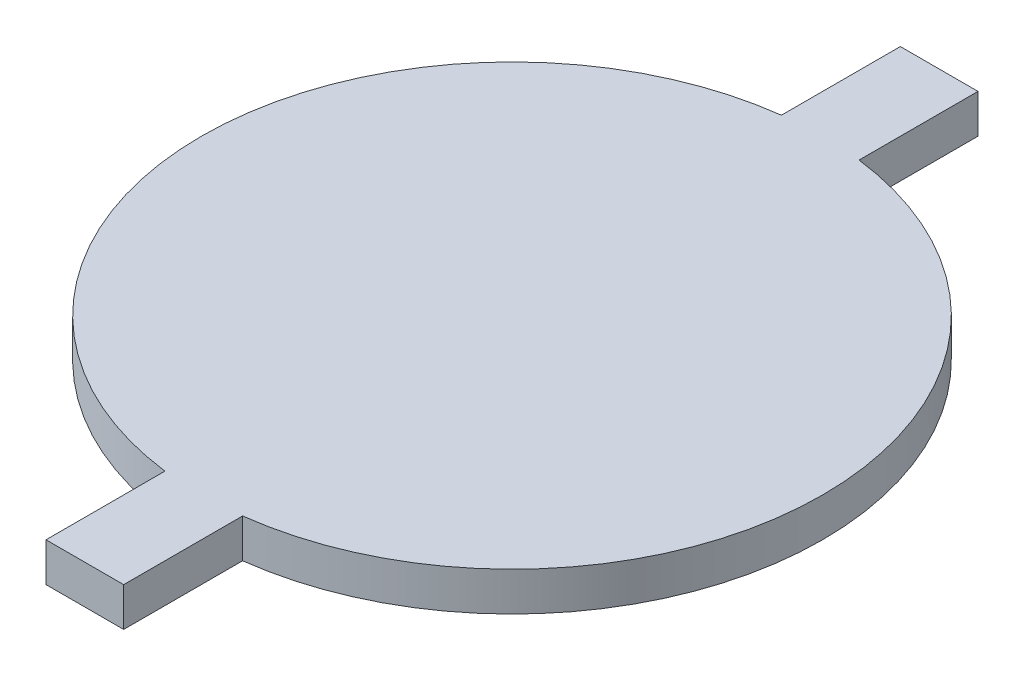
ISO-10303-21;
HEADER;
FILE_DESCRIPTION(('STEP AP214'),'2;1');
FILE_NAME('part.step','',(''),(''),'','','');
FILE_SCHEMA(('AUTOMOTIVE_DESIGN { 1 0 10303 214 1 1 1 1 }'));
ENDSEC;
DATA;
#1=APPLICATION_CONTEXT('core data for automotive mechanical design processes');
#2=APPLICATION_PROTOCOL_DEFINITION('international standard','automotive_design',2000,#1);
#3=PRODUCT_CONTEXT('',#1,'mechanical');
#4=PRODUCT('Part','Part','',(#3));
#5=PRODUCT_RELATED_PRODUCT_CATEGORY('part','',(#4));
#6=PRODUCT_DEFINITION_FORMATION('','',#4);
#7=PRODUCT_DEFINITION_CONTEXT('part definition',#1,'design');
#8=PRODUCT_DEFINITION('design','',#6,#7);
#9=PRODUCT_DEFINITION_SHAPE('','',#8);
#10=(LENGTH_UNIT() NAMED_UNIT(*) SI_UNIT(.MILLI.,.METRE.));
#11=(NAMED_UNIT(*) PLANE_ANGLE_UNIT() SI_UNIT($,.RADIAN.));
#12=(NAMED_UNIT(*) SI_UNIT($,.STERADIAN.) SOLID_ANGLE_UNIT());
#13=UNCERTAINTY_MEASURE_WITH_UNIT(LENGTH_MEASURE(1.E-05),#10,'distance_accuracy_value','');
#14=(GEOMETRIC_REPRESENTATION_CONTEXT(3) GLOBAL_UNCERTAINTY_ASSIGNED_CONTEXT((#13)) GLOBAL_UNIT_ASSIGNED_CONTEXT((#10,
#11,#12)) REPRESENTATION_CONTEXT('',''));
#15=CARTESIAN_POINT('',(0.,0.,0.));
#16=DIRECTION('',(0.,0.,1.));
#17=DIRECTION('',(1.,0.,0.));
#18=AXIS2_PLACEMENT_3D('',#15,#16,#17);
#19=CARTESIAN_POINT('',(0.,5.,0.));
#20=DIRECTION('',(0.,-1.,0.));
#21=DIRECTION('',(0.,0.,-1.));
#22=AXIS2_PLACEMENT_3D('',#19,#20,#21);
#23=CYLINDRICAL_SURFACE('',#22,40.);
#24=CARTESIAN_POINT('',(0.,0.,0.));
#25=DIRECTION('',(0.,1.,0.));
#26=DIRECTION('',(0.,0.,1.));
#27=AXIS2_PLACEMENT_3D('',#24,#25,#26);
#28=CIRCLE('',#27,40.);
#29=CARTESIAN_POINT('',(-5.,0.,-39.6862696659689));
#30=VERTEX_POINT('',#29);
#31=CARTESIAN_POINT('',(-5.,0.,39.6862696659689));
#32=VERTEX_POINT('',#31);
#33=EDGE_CURVE('E132',#30,#32,#28,.T.);
#34=ORIENTED_EDGE('',*,*,#33,.T.);
#35=DIRECTION('',(0.,-1.,0.));
#36=VECTOR('',#35,1.);
#37=CARTESIAN_POINT('',(-5.,5.,39.6862696659689));
#38=LINE('',#37,#36);
#39=CARTESIAN_POINT('',(-5.,5.,39.6862696659689));
#40=VERTEX_POINT('',#39);
#41=EDGE_CURVE('E11',#40,#32,#38,.T.);
#42=ORIENTED_EDGE('',*,*,#41,.F.);
#43=CARTESIAN_POINT('',(0.,5.,0.));
#44=DIRECTION('',(0.,1.,0.));
#45=DIRECTION('',(0.,0.,1.));
#46=AXIS2_PLACEMENT_3D('',#43,#44,#45);
#47=CIRCLE('',#46,40.);
#48=CARTESIAN_POINT('',(-5.,5.,-39.6862696659689));
#49=VERTEX_POINT('',#48);
#50=EDGE_CURVE('E91',#49,#40,#47,.T.);
#51=ORIENTED_EDGE('',*,*,#50,.F.);
#52=DIRECTION('',(0.,-1.,0.));
#53=VECTOR('',#52,1.);
#54=CARTESIAN_POINT('',(-5.,5.,-39.6862696659689));
#55=LINE('',#54,#53);
#56=EDGE_CURVE('E53',#49,#30,#55,.T.);
#57=ORIENTED_EDGE('',*,*,#56,.T.);
#58=EDGE_LOOP('',(#34,#42,#51,#57));
#59=FACE_BOUND('',#58,.T.);
#60=ADVANCED_FACE('F37',(#59),#23,.T.);
#61=CARTESIAN_POINT('',(-5.,5.,0.));
#62=DIRECTION('',(-1.,0.,0.));
#63=DIRECTION('',(0.,0.,1.));
#64=AXIS2_PLACEMENT_3D('',#61,#62,#63);
#65=PLANE('',#64);
#66=DIRECTION('',(0.,0.,-1.));
#67=VECTOR('',#66,1.);
#68=CARTESIAN_POINT('',(-5.,0.,0.));
#69=LINE('',#68,#67);
#70=CARTESIAN_POINT('',(-5.,0.,55.));
#71=VERTEX_POINT('',#70);
#72=EDGE_CURVE('E134',#71,#32,#69,.T.);
#73=ORIENTED_EDGE('',*,*,#72,.F.);
#74=DIRECTION('',(0.,-1.,0.));
#75=VECTOR('',#74,1.);
#76=CARTESIAN_POINT('',(-5.,5.,55.));
#77=LINE('',#76,#75);
#78=CARTESIAN_POINT('',(-5.,5.,55.));
#79=VERTEX_POINT('',#78);
#80=EDGE_CURVE('E45',#79,#71,#77,.T.);
#81=ORIENTED_EDGE('',*,*,#80,.F.);
#82=DIRECTION('',(0.,0.,-1.));
#83=VECTOR('',#82,1.);
#84=CARTESIAN_POINT('',(-5.,5.,0.));
#85=LINE('',#84,#83);
#86=EDGE_CURVE('E181',#79,#40,#85,.T.);
#87=ORIENTED_EDGE('',*,*,#86,.T.);
#88=ORIENTED_EDGE('',*,*,#41,.T.);
#89=EDGE_LOOP('',(#73,#81,#87,#88));
#90=FACE_BOUND('',#89,.T.);
#91=ADVANCED_FACE('F166',(#90),#65,.T.);
#92=CARTESIAN_POINT('',(0.,5.,55.));
#93=DIRECTION('',(0.,0.,1.));
#94=DIRECTION('',(1.,0.,0.));
#95=AXIS2_PLACEMENT_3D('',#92,#93,#94);
#96=PLANE('',#95);
#97=DIRECTION('',(-1.,0.,0.));
#98=VECTOR('',#97,1.);
#99=CARTESIAN_POINT('',(0.,0.,55.));
#100=LINE('',#99,#98);
#101=CARTESIAN_POINT('',(5.,0.,55.));
#102=VERTEX_POINT('',#101);
#103=EDGE_CURVE('E137',#102,#71,#100,.T.);
#104=ORIENTED_EDGE('',*,*,#103,.F.);
#105=DIRECTION('',(0.,-1.,0.));
#106=VECTOR('',#105,1.);
#107=CARTESIAN_POINT('',(5.,5.,55.));
#108=LINE('',#107,#106);
#109=CARTESIAN_POINT('',(5.,5.,55.));
#110=VERTEX_POINT('',#109);
#111=EDGE_CURVE('E156',#110,#102,#108,.T.);
#112=ORIENTED_EDGE('',*,*,#111,.F.);
#113=DIRECTION('',(-1.,0.,0.));
#114=VECTOR('',#113,1.);
#115=CARTESIAN_POINT('',(0.,5.,55.));
#116=LINE('',#115,#114);
#117=EDGE_CURVE('E163',#110,#79,#116,.T.);
#118=ORIENTED_EDGE('',*,*,#117,.T.);
#119=ORIENTED_EDGE('',*,*,#80,.T.);
#120=EDGE_LOOP('',(#104,#112,#118,#119));
#121=FACE_BOUND('',#120,.T.);
#122=ADVANCED_FACE('F161',(#121),#96,.T.);
#123=CARTESIAN_POINT('',(5.,5.,0.));
#124=DIRECTION('',(-1.,0.,0.));
#125=DIRECTION('',(0.,0.,1.));
#126=AXIS2_PLACEMENT_3D('',#123,#124,#125);
#127=PLANE('',#126);
#128=DIRECTION('',(0.,0.,-1.));
#129=VECTOR('',#128,1.);
#130=CARTESIAN_POINT('',(5.,0.,0.));
#131=LINE('',#130,#129);
#132=CARTESIAN_POINT('',(5.,0.,39.6862696659689));
#133=VERTEX_POINT('',#132);
#134=EDGE_CURVE('E140',#102,#133,#131,.T.);
#135=ORIENTED_EDGE('',*,*,#134,.T.);
#136=DIRECTION('',(0.,-1.,0.));
#137=VECTOR('',#136,1.);
#138=CARTESIAN_POINT('',(5.,5.,39.6862696659689));
#139=LINE('',#138,#137);
#140=CARTESIAN_POINT('',(5.,5.,39.6862696659689));
#141=VERTEX_POINT('',#140);
#142=EDGE_CURVE('E153',#141,#133,#139,.T.);
#143=ORIENTED_EDGE('',*,*,#142,.F.);
#144=DIRECTION('',(0.,0.,-1.));
#145=VECTOR('',#144,1.);
#146=CARTESIAN_POINT('',(5.,5.,0.));
#147=LINE('',#146,#145);
#148=EDGE_CURVE('E177',#110,#141,#147,.T.);
#149=ORIENTED_EDGE('',*,*,#148,.F.);
#150=ORIENTED_EDGE('',*,*,#111,.T.);
#151=EDGE_LOOP('',(#135,#143,#149,#150));
#152=FACE_BOUND('',#151,.T.);
#153=ADVANCED_FACE('F173',(#152),#127,.F.);
#154=CARTESIAN_POINT('',(0.,5.,0.));
#155=DIRECTION('',(0.,-1.,0.));
#156=DIRECTION('',(0.,0.,-1.));
#157=AXIS2_PLACEMENT_3D('',#154,#155,#156);
#158=CYLINDRICAL_SURFACE('',#157,40.);
#159=CARTESIAN_POINT('',(0.,0.,0.));
#160=DIRECTION('',(0.,1.,0.));
#161=DIRECTION('',(0.,0.,1.));
#162=AXIS2_PLACEMENT_3D('',#159,#160,#161);
#163=CIRCLE('',#162,40.);
#164=CARTESIAN_POINT('',(5.,0.,-39.6862696659689));
#165=VERTEX_POINT('',#164);
#166=EDGE_CURVE('E142',#133,#165,#163,.T.);
#167=ORIENTED_EDGE('',*,*,#166,.T.);
#168=DIRECTION('',(0.,-1.,0.));
#169=VECTOR('',#168,1.);
#170=CARTESIAN_POINT('',(5.,5.,-39.6862696659689));
#171=LINE('',#170,#169);
#172=CARTESIAN_POINT('',(5.,5.,-39.6862696659689));
#173=VERTEX_POINT('',#172);
#174=EDGE_CURVE('E124',#173,#165,#171,.T.);
#175=ORIENTED_EDGE('',*,*,#174,.F.);
#176=CARTESIAN_POINT('',(0.,5.,0.));
#177=DIRECTION('',(0.,1.,0.));
#178=DIRECTION('',(0.,0.,1.));
#179=AXIS2_PLACEMENT_3D('',#176,#177,#178);
#180=CIRCLE('',#179,40.);
#181=EDGE_CURVE('E112',#141,#173,#180,.T.);
#182=ORIENTED_EDGE('',*,*,#181,.F.);
#183=ORIENTED_EDGE('',*,*,#142,.T.);
#184=EDGE_LOOP('',(#167,#175,#182,#183));
#185=FACE_BOUND('',#184,.T.);
#186=ADVANCED_FACE('F176',(#185),#158,.T.);
#187=CARTESIAN_POINT('',(5.,5.,0.));
#188=DIRECTION('',(-1.,0.,0.));
#189=DIRECTION('',(0.,0.,1.));
#190=AXIS2_PLACEMENT_3D('',#187,#188,#189);
#191=PLANE('',#190);
#192=DIRECTION('',(0.,0.,-1.));
#193=VECTOR('',#192,1.);
#194=CARTESIAN_POINT('',(5.,0.,0.));
#195=LINE('',#194,#193);
#196=CARTESIAN_POINT('',(5.,0.,-55.));
#197=VERTEX_POINT('',#196);
#198=EDGE_CURVE('E121',#165,#197,#195,.T.);
#199=ORIENTED_EDGE('',*,*,#198,.T.);
#200=DIRECTION('',(0.,-1.,0.));
#201=VECTOR('',#200,1.);
#202=CARTESIAN_POINT('',(5.,5.,-55.));
#203=LINE('',#202,#201);
#204=CARTESIAN_POINT('',(5.,5.,-55.));
#205=VERTEX_POINT('',#204);
#206=EDGE_CURVE('E118',#205,#197,#203,.T.);
#207=ORIENTED_EDGE('',*,*,#206,.F.);
#208=DIRECTION('',(0.,0.,-1.));
#209=VECTOR('',#208,1.);
#210=CARTESIAN_POINT('',(5.,5.,0.));
#211=LINE('',#210,#209);
#212=EDGE_CURVE('E106',#173,#205,#211,.T.);
#213=ORIENTED_EDGE('',*,*,#212,.F.);
#214=ORIENTED_EDGE('',*,*,#174,.T.);
#215=EDGE_LOOP('',(#199,#207,#213,#214));
#216=FACE_BOUND('',#215,.T.);
#217=ADVANCED_FACE('F119',(#216),#191,.F.);
#218=CARTESIAN_POINT('',(0.,5.,-55.));
#219=DIRECTION('',(0.,0.,1.));
#220=DIRECTION('',(1.,0.,0.));
#221=AXIS2_PLACEMENT_3D('',#218,#219,#220);
#222=PLANE('',#221);
#223=DIRECTION('',(-1.,0.,0.));
#224=VECTOR('',#223,1.);
#225=CARTESIAN_POINT('',(0.,0.,-55.));
#226=LINE('',#225,#224);
#227=CARTESIAN_POINT('',(-5.,0.,-55.));
#228=VERTEX_POINT('',#227);
#229=EDGE_CURVE('E145',#197,#228,#226,.T.);
#230=ORIENTED_EDGE('',*,*,#229,.T.);
#231=DIRECTION('',(0.,-1.,0.));
#232=VECTOR('',#231,1.);
#233=CARTESIAN_POINT('',(-5.,5.,-55.));
#234=LINE('',#233,#232);
#235=CARTESIAN_POINT('',(-5.,5.,-55.));
#236=VERTEX_POINT('',#235);
#237=EDGE_CURVE('E79',#236,#228,#234,.T.);
#238=ORIENTED_EDGE('',*,*,#237,.F.);
#239=DIRECTION('',(-1.,0.,0.));
#240=VECTOR('',#239,1.);
#241=CARTESIAN_POINT('',(0.,5.,-55.));
#242=LINE('',#241,#240);
#243=EDGE_CURVE('E110',#205,#236,#242,.T.);
#244=ORIENTED_EDGE('',*,*,#243,.F.);
#245=ORIENTED_EDGE('',*,*,#206,.T.);
#246=EDGE_LOOP('',(#230,#238,#244,#245));
#247=FACE_BOUND('',#246,.T.);
#248=ADVANCED_FACE('F126',(#247),#222,.F.);
#249=CARTESIAN_POINT('',(-5.,5.,0.));
#250=DIRECTION('',(-1.,0.,0.));
#251=DIRECTION('',(0.,0.,1.));
#252=AXIS2_PLACEMENT_3D('',#249,#250,#251);
#253=PLANE('',#252);
#254=DIRECTION('',(0.,0.,-1.));
#255=VECTOR('',#254,1.);
#256=CARTESIAN_POINT('',(-5.,0.,0.));
#257=LINE('',#256,#255);
#258=EDGE_CURVE('E147',#30,#228,#257,.T.);
#259=ORIENTED_EDGE('',*,*,#258,.F.);
#260=ORIENTED_EDGE('',*,*,#56,.F.);
#261=DIRECTION('',(0.,0.,-1.));
#262=VECTOR('',#261,1.);
#263=CARTESIAN_POINT('',(-5.,5.,0.));
#264=LINE('',#263,#262);
#265=EDGE_CURVE('E127',#49,#236,#264,.T.);
#266=ORIENTED_EDGE('',*,*,#265,.T.);
#267=ORIENTED_EDGE('',*,*,#237,.T.);
#268=EDGE_LOOP('',(#259,#260,#266,#267));
#269=FACE_BOUND('',#268,.T.);
#270=ADVANCED_FACE('F183',(#269),#253,.T.);
#271=CARTESIAN_POINT('',(0.,5.,0.));
#272=DIRECTION('',(0.,1.,0.));
#273=DIRECTION('',(0.,0.,1.));
#274=AXIS2_PLACEMENT_3D('',#271,#272,#273);
#275=PLANE('',#274);
#276=ORIENTED_EDGE('',*,*,#50,.T.);
#277=ORIENTED_EDGE('',*,*,#86,.F.);
#278=ORIENTED_EDGE('',*,*,#117,.F.);
#279=ORIENTED_EDGE('',*,*,#148,.T.);
#280=ORIENTED_EDGE('',*,*,#181,.T.);
#281=ORIENTED_EDGE('',*,*,#212,.T.);
#282=ORIENTED_EDGE('',*,*,#243,.T.);
#283=ORIENTED_EDGE('',*,*,#265,.F.);
#284=EDGE_LOOP('',(#276,#277,#278,#279,#280,#281,#282,#283));
#285=FACE_BOUND('',#284,.T.);
#286=ADVANCED_FACE('F108',(#285),#275,.T.);
#287=CARTESIAN_POINT('',(0.,0.,0.));
#288=DIRECTION('',(0.,1.,0.));
#289=DIRECTION('',(0.,0.,1.));
#290=AXIS2_PLACEMENT_3D('',#287,#288,#289);
#291=PLANE('',#290);
#292=ORIENTED_EDGE('',*,*,#33,.F.);
#293=ORIENTED_EDGE('',*,*,#258,.T.);
#294=ORIENTED_EDGE('',*,*,#229,.F.);
#295=ORIENTED_EDGE('',*,*,#198,.F.);
#296=ORIENTED_EDGE('',*,*,#166,.F.);
#297=ORIENTED_EDGE('',*,*,#134,.F.);
#298=ORIENTED_EDGE('',*,*,#103,.T.);
#299=ORIENTED_EDGE('',*,*,#72,.T.);
#300=EDGE_LOOP('',(#292,#293,#294,#295,#296,#297,#298,#299));
#301=FACE_BOUND('',#300,.T.);
#302=ADVANCED_FACE('F169',(#301),#291,.F.);
#303=CLOSED_SHELL('',(#60,#91,#122,#153,#186,#217,#248,#270,#286,#302));
#304=MANIFOLD_SOLID_BREP('B2',#303);
#305=ADVANCED_BREP_SHAPE_REPRESENTATION('',(#18,#304),#14);
#306=SHAPE_DEFINITION_REPRESENTATION(#9,#305);
ENDSEC;
END-ISO-10303-21;
